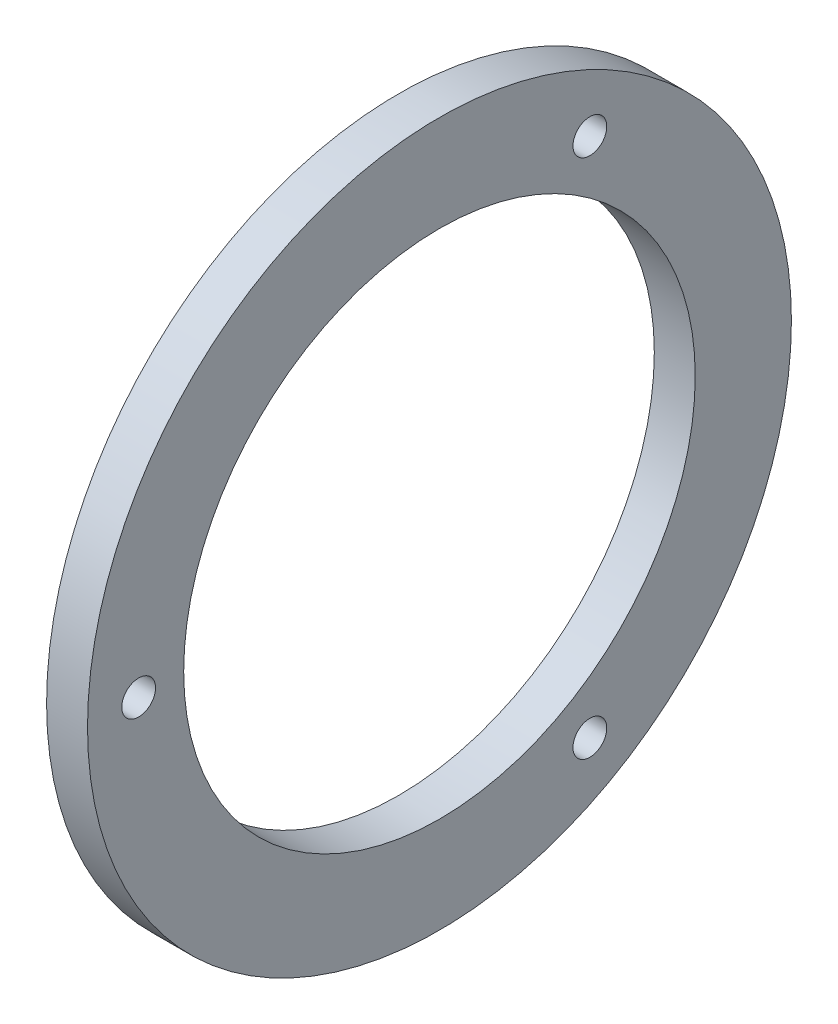
ISO-10303-21;
HEADER;
FILE_DESCRIPTION(('STEP AP214'),'2;1');
FILE_NAME('part.step','',(''),(''),'','','');
FILE_SCHEMA(('AUTOMOTIVE_DESIGN { 1 0 10303 214 1 1 1 1 }'));
ENDSEC;
DATA;
#1=APPLICATION_CONTEXT('core data for automotive mechanical design processes');
#2=APPLICATION_PROTOCOL_DEFINITION('international standard','automotive_design',2000,#1);
#3=PRODUCT_CONTEXT('',#1,'mechanical');
#4=PRODUCT('Part','Part','',(#3));
#5=PRODUCT_RELATED_PRODUCT_CATEGORY('part','',(#4));
#6=PRODUCT_DEFINITION_FORMATION('','',#4);
#7=PRODUCT_DEFINITION_CONTEXT('part definition',#1,'design');
#8=PRODUCT_DEFINITION('design','',#6,#7);
#9=PRODUCT_DEFINITION_SHAPE('','',#8);
#10=(LENGTH_UNIT() NAMED_UNIT(*) SI_UNIT(.MILLI.,.METRE.));
#11=(NAMED_UNIT(*) PLANE_ANGLE_UNIT() SI_UNIT($,.RADIAN.));
#12=(NAMED_UNIT(*) SI_UNIT($,.STERADIAN.) SOLID_ANGLE_UNIT());
#13=UNCERTAINTY_MEASURE_WITH_UNIT(LENGTH_MEASURE(1.E-05),#10,'distance_accuracy_value','');
#14=(GEOMETRIC_REPRESENTATION_CONTEXT(3) GLOBAL_UNCERTAINTY_ASSIGNED_CONTEXT((#13)) GLOBAL_UNIT_ASSIGNED_CONTEXT((#10,
#11,#12)) REPRESENTATION_CONTEXT('',''));
#15=CARTESIAN_POINT('',(0.,0.,0.));
#16=DIRECTION('',(0.,0.,1.));
#17=DIRECTION('',(1.,0.,0.));
#18=AXIS2_PLACEMENT_3D('',#15,#16,#17);
#19=CARTESIAN_POINT('',(159.7,34.4,0.));
#20=DIRECTION('',(1.,0.,0.));
#21=DIRECTION('',(0.,0.,-1.));
#22=AXIS2_PLACEMENT_3D('',#19,#20,#21);
#23=PLANE('',#22);
#24=CARTESIAN_POINT('',(159.7,0.,29.4));
#25=DIRECTION('',(1.,0.,0.));
#26=DIRECTION('',(0.,0.,-1.));
#27=AXIS2_PLACEMENT_3D('',#24,#25,#26);
#28=CIRCLE('',#27,1.65);
#29=CARTESIAN_POINT('',(159.7,0.,27.75));
#30=VERTEX_POINT('',#29);
#31=EDGE_CURVE('E60',#30,#30,#28,.F.);
#32=ORIENTED_EDGE('',*,*,#31,.F.);
#33=EDGE_LOOP('',(#32));
#34=FACE_BOUND('',#33,.T.);
#35=CARTESIAN_POINT('',(159.7,-25.4611468712625,-14.7));
#36=DIRECTION('',(1.,0.,0.));
#37=DIRECTION('',(0.,0.,-1.));
#38=AXIS2_PLACEMENT_3D('',#35,#36,#37);
#39=CIRCLE('',#38,1.65);
#40=CARTESIAN_POINT('',(159.7,-25.4611468712625,-16.35));
#41=VERTEX_POINT('',#40);
#42=EDGE_CURVE('E64',#41,#41,#39,.F.);
#43=ORIENTED_EDGE('',*,*,#42,.F.);
#44=EDGE_LOOP('',(#43));
#45=FACE_BOUND('',#44,.T.);
#46=CARTESIAN_POINT('',(159.7,25.4611468712625,-14.7));
#47=DIRECTION('',(1.,0.,0.));
#48=DIRECTION('',(0.,0.,-1.));
#49=AXIS2_PLACEMENT_3D('',#46,#47,#48);
#50=CIRCLE('',#49,1.65);
#51=CARTESIAN_POINT('',(159.7,25.4611468712625,-16.35));
#52=VERTEX_POINT('',#51);
#53=EDGE_CURVE('E68',#52,#52,#50,.F.);
#54=ORIENTED_EDGE('',*,*,#53,.F.);
#55=EDGE_LOOP('',(#54));
#56=FACE_BOUND('',#55,.T.);
#57=CARTESIAN_POINT('',(159.7,0.,0.));
#58=DIRECTION('',(-1.,0.,0.));
#59=DIRECTION('',(0.,0.,1.));
#60=AXIS2_PLACEMENT_3D('',#57,#58,#59);
#61=CIRCLE('',#60,25.);
#62=CARTESIAN_POINT('',(159.7,0.,25.));
#63=VERTEX_POINT('',#62);
#64=EDGE_CURVE('E10',#63,#63,#61,.T.);
#65=ORIENTED_EDGE('',*,*,#64,.F.);
#66=EDGE_LOOP('',(#65));
#67=FACE_BOUND('',#66,.T.);
#68=CARTESIAN_POINT('',(159.7,0.,0.));
#69=DIRECTION('',(-1.,0.,0.));
#70=DIRECTION('',(0.,0.,1.));
#71=AXIS2_PLACEMENT_3D('',#68,#69,#70);
#72=CIRCLE('',#71,34.4);
#73=CARTESIAN_POINT('',(159.7,0.,34.4));
#74=VERTEX_POINT('',#73);
#75=EDGE_CURVE('E54',#74,#74,#72,.T.);
#76=ORIENTED_EDGE('',*,*,#75,.T.);
#77=EDGE_LOOP('',(#76));
#78=FACE_BOUND('',#77,.T.);
#79=ADVANCED_FACE('F37',(#34,#45,#56,#67,#78),#23,.F.);
#80=CARTESIAN_POINT('',(-110.,0.,0.));
#81=DIRECTION('',(-1.,0.,0.));
#82=DIRECTION('',(0.,0.,1.));
#83=AXIS2_PLACEMENT_3D('',#80,#81,#82);
#84=CYLINDRICAL_SURFACE('',#83,25.);
#85=CARTESIAN_POINT('',(163.7,0.,0.));
#86=DIRECTION('',(-1.,0.,0.));
#87=DIRECTION('',(0.,0.,1.));
#88=AXIS2_PLACEMENT_3D('',#85,#86,#87);
#89=CIRCLE('',#88,25.);
#90=CARTESIAN_POINT('',(163.7,0.,25.));
#91=VERTEX_POINT('',#90);
#92=EDGE_CURVE('E44',#91,#91,#89,.T.);
#93=ORIENTED_EDGE('',*,*,#92,.F.);
#94=EDGE_LOOP('',(#93));
#95=FACE_BOUND('',#94,.T.);
#96=ORIENTED_EDGE('',*,*,#64,.T.);
#97=EDGE_LOOP('',(#96));
#98=FACE_BOUND('',#97,.T.);
#99=ADVANCED_FACE('F92',(#95,#98),#84,.F.);
#100=CARTESIAN_POINT('',(163.7,25.,0.));
#101=DIRECTION('',(-1.,0.,0.));
#102=DIRECTION('',(0.,0.,1.));
#103=AXIS2_PLACEMENT_3D('',#100,#101,#102);
#104=PLANE('',#103);
#105=CARTESIAN_POINT('',(163.7,0.,29.4));
#106=DIRECTION('',(1.,0.,0.));
#107=DIRECTION('',(0.,0.,-1.));
#108=AXIS2_PLACEMENT_3D('',#105,#106,#107);
#109=CIRCLE('',#108,1.65);
#110=CARTESIAN_POINT('',(163.7,0.,27.75));
#111=VERTEX_POINT('',#110);
#112=EDGE_CURVE('E72',#111,#111,#109,.T.);
#113=ORIENTED_EDGE('',*,*,#112,.F.);
#114=EDGE_LOOP('',(#113));
#115=FACE_BOUND('',#114,.T.);
#116=CARTESIAN_POINT('',(163.7,-25.4611468712625,-14.7));
#117=DIRECTION('',(1.,0.,0.));
#118=DIRECTION('',(0.,0.,-1.));
#119=AXIS2_PLACEMENT_3D('',#116,#117,#118);
#120=CIRCLE('',#119,1.65);
#121=CARTESIAN_POINT('',(163.7,-25.4611468712625,-16.35));
#122=VERTEX_POINT('',#121);
#123=EDGE_CURVE('E77',#122,#122,#120,.T.);
#124=ORIENTED_EDGE('',*,*,#123,.F.);
#125=EDGE_LOOP('',(#124));
#126=FACE_BOUND('',#125,.T.);
#127=CARTESIAN_POINT('',(163.7,25.4611468712625,-14.7));
#128=DIRECTION('',(1.,0.,0.));
#129=DIRECTION('',(0.,0.,-1.));
#130=AXIS2_PLACEMENT_3D('',#127,#128,#129);
#131=CIRCLE('',#130,1.65);
#132=CARTESIAN_POINT('',(163.7,25.4611468712625,-16.35));
#133=VERTEX_POINT('',#132);
#134=EDGE_CURVE('E73',#133,#133,#131,.T.);
#135=ORIENTED_EDGE('',*,*,#134,.F.);
#136=EDGE_LOOP('',(#135));
#137=FACE_BOUND('',#136,.T.);
#138=CARTESIAN_POINT('',(163.7,0.,0.));
#139=DIRECTION('',(-1.,0.,0.));
#140=DIRECTION('',(0.,0.,1.));
#141=AXIS2_PLACEMENT_3D('',#138,#139,#140);
#142=CIRCLE('',#141,34.4);
#143=CARTESIAN_POINT('',(163.7,0.,34.4));
#144=VERTEX_POINT('',#143);
#145=EDGE_CURVE('E49',#144,#144,#142,.T.);
#146=ORIENTED_EDGE('',*,*,#145,.F.);
#147=EDGE_LOOP('',(#146));
#148=FACE_BOUND('',#147,.T.);
#149=ORIENTED_EDGE('',*,*,#92,.T.);
#150=EDGE_LOOP('',(#149));
#151=FACE_BOUND('',#150,.T.);
#152=ADVANCED_FACE('F88',(#115,#126,#137,#148,#151),#104,.F.);
#153=CARTESIAN_POINT('',(-110.,0.,0.));
#154=DIRECTION('',(-1.,0.,0.));
#155=DIRECTION('',(0.,0.,1.));
#156=AXIS2_PLACEMENT_3D('',#153,#154,#155);
#157=CYLINDRICAL_SURFACE('',#156,34.4);
#158=ORIENTED_EDGE('',*,*,#75,.F.);
#159=EDGE_LOOP('',(#158));
#160=FACE_BOUND('',#159,.T.);
#161=ORIENTED_EDGE('',*,*,#145,.T.);
#162=EDGE_LOOP('',(#161));
#163=FACE_BOUND('',#162,.T.);
#164=ADVANCED_FACE('F91',(#160,#163),#157,.T.);
#165=CARTESIAN_POINT('',(159.7,25.4611468712625,-14.7));
#166=DIRECTION('',(-1.,0.,0.));
#167=DIRECTION('',(0.,0.,1.));
#168=AXIS2_PLACEMENT_3D('',#165,#166,#167);
#169=CYLINDRICAL_SURFACE('',#168,1.65);
#170=ORIENTED_EDGE('',*,*,#134,.T.);
#171=EDGE_LOOP('',(#170));
#172=FACE_BOUND('',#171,.T.);
#173=ORIENTED_EDGE('',*,*,#53,.T.);
#174=EDGE_LOOP('',(#173));
#175=FACE_BOUND('',#174,.T.);
#176=ADVANCED_FACE('F101',(#172,#175),#169,.F.);
#177=CARTESIAN_POINT('',(159.7,-25.4611468712625,-14.7));
#178=DIRECTION('',(-1.,0.,0.));
#179=DIRECTION('',(0.,0.,1.));
#180=AXIS2_PLACEMENT_3D('',#177,#178,#179);
#181=CYLINDRICAL_SURFACE('',#180,1.65);
#182=ORIENTED_EDGE('',*,*,#123,.T.);
#183=EDGE_LOOP('',(#182));
#184=FACE_BOUND('',#183,.T.);
#185=ORIENTED_EDGE('',*,*,#42,.T.);
#186=EDGE_LOOP('',(#185));
#187=FACE_BOUND('',#186,.T.);
#188=ADVANCED_FACE('F107',(#184,#187),#181,.F.);
#189=CARTESIAN_POINT('',(159.7,0.,29.4));
#190=DIRECTION('',(-1.,0.,0.));
#191=DIRECTION('',(0.,0.,1.));
#192=AXIS2_PLACEMENT_3D('',#189,#190,#191);
#193=CYLINDRICAL_SURFACE('',#192,1.65);
#194=ORIENTED_EDGE('',*,*,#112,.T.);
#195=EDGE_LOOP('',(#194));
#196=FACE_BOUND('',#195,.T.);
#197=ORIENTED_EDGE('',*,*,#31,.T.);
#198=EDGE_LOOP('',(#197));
#199=FACE_BOUND('',#198,.T.);
#200=ADVANCED_FACE('F85',(#196,#199),#193,.F.);
#201=CLOSED_SHELL('',(#79,#99,#152,#164,#176,#188,#200));
#202=MANIFOLD_SOLID_BREP('B2',#201);
#203=ADVANCED_BREP_SHAPE_REPRESENTATION('',(#18,#202),#14);
#204=SHAPE_DEFINITION_REPRESENTATION(#9,#203);
ENDSEC;
END-ISO-10303-21;
